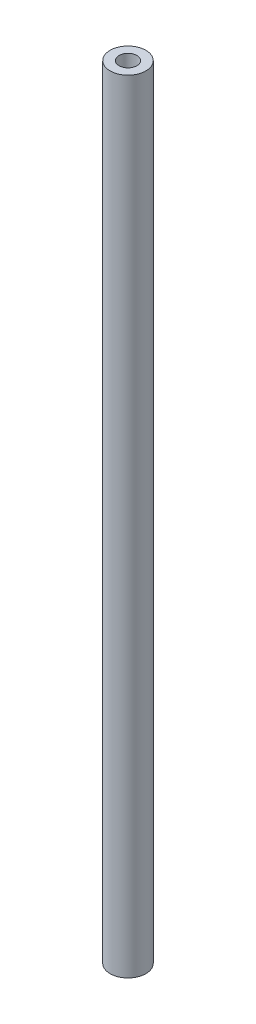
ISO-10303-21;
HEADER;
FILE_DESCRIPTION(('STEP AP214'),'2;1');
FILE_NAME('part.step','',(''),(''),'','','');
FILE_SCHEMA(('AUTOMOTIVE_DESIGN { 1 0 10303 214 1 1 1 1 }'));
ENDSEC;
DATA;
#1=APPLICATION_CONTEXT('core data for automotive mechanical design processes');
#2=APPLICATION_PROTOCOL_DEFINITION('international standard','automotive_design',2000,#1);
#3=PRODUCT_CONTEXT('',#1,'mechanical');
#4=PRODUCT('Part','Part','',(#3));
#5=PRODUCT_RELATED_PRODUCT_CATEGORY('part','',(#4));
#6=PRODUCT_DEFINITION_FORMATION('','',#4);
#7=PRODUCT_DEFINITION_CONTEXT('part definition',#1,'design');
#8=PRODUCT_DEFINITION('design','',#6,#7);
#9=PRODUCT_DEFINITION_SHAPE('','',#8);
#10=(LENGTH_UNIT() NAMED_UNIT(*) SI_UNIT(.MILLI.,.METRE.));
#11=(NAMED_UNIT(*) PLANE_ANGLE_UNIT() SI_UNIT($,.RADIAN.));
#12=(NAMED_UNIT(*) SI_UNIT($,.STERADIAN.) SOLID_ANGLE_UNIT());
#13=UNCERTAINTY_MEASURE_WITH_UNIT(LENGTH_MEASURE(1.E-05),#10,'distance_accuracy_value','');
#14=(GEOMETRIC_REPRESENTATION_CONTEXT(3) GLOBAL_UNCERTAINTY_ASSIGNED_CONTEXT((#13)) GLOBAL_UNIT_ASSIGNED_CONTEXT((#10,
#11,#12)) REPRESENTATION_CONTEXT('',''));
#15=CARTESIAN_POINT('',(0.,0.,0.));
#16=DIRECTION('',(0.,0.,1.));
#17=DIRECTION('',(1.,0.,0.));
#18=AXIS2_PLACEMENT_3D('',#15,#16,#17);
#19=CARTESIAN_POINT('',(0.,175.,0.));
#20=DIRECTION('',(0.,-1.,0.));
#21=DIRECTION('',(0.,0.,-1.));
#22=AXIS2_PLACEMENT_3D('',#19,#20,#21);
#23=CYLINDRICAL_SURFACE('',#22,4.);
#24=CARTESIAN_POINT('',(0.,175.,0.));
#25=DIRECTION('',(0.,1.,0.));
#26=DIRECTION('',(0.,0.,1.));
#27=AXIS2_PLACEMENT_3D('',#24,#25,#26);
#28=CIRCLE('',#27,4.);
#29=CARTESIAN_POINT('',(0.,175.,4.));
#30=VERTEX_POINT('',#29);
#31=EDGE_CURVE('E10',#30,#30,#28,.T.);
#32=ORIENTED_EDGE('',*,*,#31,.F.);
#33=EDGE_LOOP('',(#32));
#34=FACE_BOUND('',#33,.T.);
#35=CARTESIAN_POINT('',(0.,0.,0.));
#36=DIRECTION('',(0.,1.,0.));
#37=DIRECTION('',(0.,0.,1.));
#38=AXIS2_PLACEMENT_3D('',#35,#36,#37);
#39=CIRCLE('',#38,4.);
#40=CARTESIAN_POINT('',(0.,0.,4.));
#41=VERTEX_POINT('',#40);
#42=EDGE_CURVE('E33',#41,#41,#39,.T.);
#43=ORIENTED_EDGE('',*,*,#42,.T.);
#44=EDGE_LOOP('',(#43));
#45=FACE_BOUND('',#44,.T.);
#46=ADVANCED_FACE('F30',(#34,#45),#23,.T.);
#47=CARTESIAN_POINT('',(0.,175.,0.));
#48=DIRECTION('',(0.,1.,0.));
#49=DIRECTION('',(0.,0.,1.));
#50=AXIS2_PLACEMENT_3D('',#47,#48,#49);
#51=PLANE('',#50);
#52=CARTESIAN_POINT('',(0.,175.,0.));
#53=DIRECTION('',(0.,-1.,0.));
#54=DIRECTION('',(0.,0.,-1.));
#55=AXIS2_PLACEMENT_3D('',#52,#53,#54);
#56=CIRCLE('',#55,2.);
#57=CARTESIAN_POINT('',(0.,175.,-2.));
#58=VERTEX_POINT('',#57);
#59=EDGE_CURVE('E48',#58,#58,#56,.T.);
#60=ORIENTED_EDGE('',*,*,#59,.T.);
#61=EDGE_LOOP('',(#60));
#62=FACE_BOUND('',#61,.T.);
#63=ORIENTED_EDGE('',*,*,#31,.T.);
#64=EDGE_LOOP('',(#63));
#65=FACE_BOUND('',#64,.T.);
#66=ADVANCED_FACE('F66',(#62,#65),#51,.T.);
#67=CARTESIAN_POINT('',(0.,0.,0.));
#68=DIRECTION('',(0.,1.,0.));
#69=DIRECTION('',(0.,0.,1.));
#70=AXIS2_PLACEMENT_3D('',#67,#68,#69);
#71=PLANE('',#70);
#72=CARTESIAN_POINT('',(0.,0.,0.));
#73=DIRECTION('',(0.,-1.,0.));
#74=DIRECTION('',(0.,0.,-1.));
#75=AXIS2_PLACEMENT_3D('',#72,#73,#74);
#76=CIRCLE('',#75,2.);
#77=CARTESIAN_POINT('',(0.,0.,-2.));
#78=VERTEX_POINT('',#77);
#79=EDGE_CURVE('E42',#78,#78,#76,.T.);
#80=ORIENTED_EDGE('',*,*,#79,.F.);
#81=EDGE_LOOP('',(#80));
#82=FACE_BOUND('',#81,.T.);
#83=ORIENTED_EDGE('',*,*,#42,.F.);
#84=EDGE_LOOP('',(#83));
#85=FACE_BOUND('',#84,.T.);
#86=ADVANCED_FACE('F71',(#82,#85),#71,.F.);
#87=CARTESIAN_POINT('',(0.,30.,0.));
#88=DIRECTION('',(0.,-1.,0.));
#89=DIRECTION('',(0.,0.,-1.));
#90=AXIS2_PLACEMENT_3D('',#87,#88,#89);
#91=CYLINDRICAL_SURFACE('',#90,2.);
#92=CARTESIAN_POINT('',(0.,30.,0.));
#93=DIRECTION('',(0.,-1.,0.));
#94=DIRECTION('',(0.,0.,-1.));
#95=AXIS2_PLACEMENT_3D('',#92,#93,#94);
#96=CIRCLE('',#95,2.);
#97=CARTESIAN_POINT('',(0.,30.,-2.));
#98=VERTEX_POINT('',#97);
#99=EDGE_CURVE('E40',#98,#98,#96,.T.);
#100=ORIENTED_EDGE('',*,*,#99,.F.);
#101=EDGE_LOOP('',(#100));
#102=FACE_BOUND('',#101,.T.);
#103=ORIENTED_EDGE('',*,*,#79,.T.);
#104=EDGE_LOOP('',(#103));
#105=FACE_BOUND('',#104,.T.);
#106=ADVANCED_FACE('F78',(#102,#105),#91,.F.);
#107=CARTESIAN_POINT('',(0.,30.,0.));
#108=DIRECTION('',(0.,-1.,0.));
#109=DIRECTION('',(0.,0.,-1.));
#110=AXIS2_PLACEMENT_3D('',#107,#108,#109);
#111=PLANE('',#110);
#112=ORIENTED_EDGE('',*,*,#99,.T.);
#113=EDGE_LOOP('',(#112));
#114=FACE_BOUND('',#113,.T.);
#115=ADVANCED_FACE('F63',(#114),#111,.T.);
#116=CARTESIAN_POINT('',(0.,145.,0.));
#117=DIRECTION('',(0.,1.,0.));
#118=DIRECTION('',(0.,0.,1.));
#119=AXIS2_PLACEMENT_3D('',#116,#117,#118);
#120=CYLINDRICAL_SURFACE('',#119,2.);
#121=CARTESIAN_POINT('',(0.,145.,0.));
#122=DIRECTION('',(0.,-1.,0.));
#123=DIRECTION('',(0.,0.,-1.));
#124=AXIS2_PLACEMENT_3D('',#121,#122,#123);
#125=CIRCLE('',#124,2.);
#126=CARTESIAN_POINT('',(0.,145.,-2.));
#127=VERTEX_POINT('',#126);
#128=EDGE_CURVE('E45',#127,#127,#125,.T.);
#129=ORIENTED_EDGE('',*,*,#128,.T.);
#130=EDGE_LOOP('',(#129));
#131=FACE_BOUND('',#130,.T.);
#132=ORIENTED_EDGE('',*,*,#59,.F.);
#133=EDGE_LOOP('',(#132));
#134=FACE_BOUND('',#133,.T.);
#135=ADVANCED_FACE('F54',(#131,#134),#120,.F.);
#136=CARTESIAN_POINT('',(0.,145.,0.));
#137=DIRECTION('',(0.,1.,0.));
#138=DIRECTION('',(0.,0.,-1.));
#139=AXIS2_PLACEMENT_3D('',#136,#137,#138);
#140=PLANE('',#139);
#141=ORIENTED_EDGE('',*,*,#128,.F.);
#142=EDGE_LOOP('',(#141));
#143=FACE_BOUND('',#142,.T.);
#144=ADVANCED_FACE('F57',(#143),#140,.T.);
#145=CLOSED_SHELL('',(#46,#66,#86,#106,#115,#135,#144));
#146=MANIFOLD_SOLID_BREP('B2',#145);
#147=ADVANCED_BREP_SHAPE_REPRESENTATION('',(#18,#146),#14);
#148=SHAPE_DEFINITION_REPRESENTATION(#9,#147);
ENDSEC;
END-ISO-10303-21;
